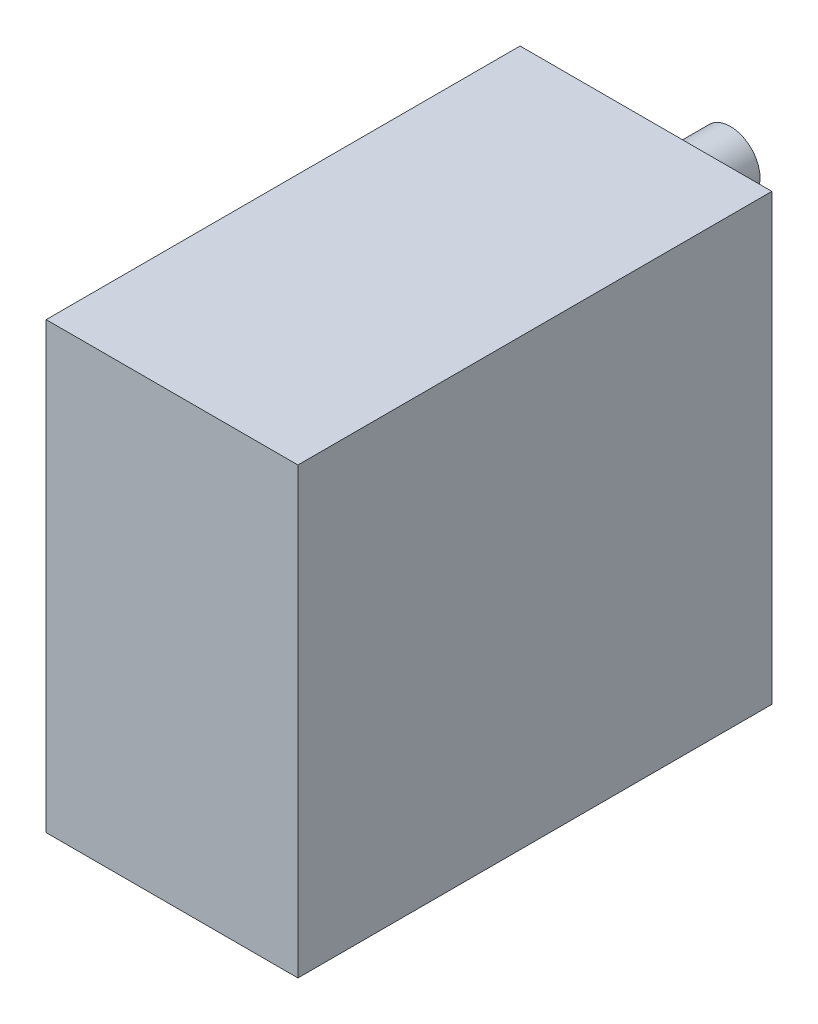
ISO-10303-21;
HEADER;
FILE_DESCRIPTION(('STEP AP214'),'2;1');
FILE_NAME('part.step','',(''),(''),'','','');
FILE_SCHEMA(('AUTOMOTIVE_DESIGN { 1 0 10303 214 1 1 1 1 }'));
ENDSEC;
DATA;
#1=APPLICATION_CONTEXT('core data for automotive mechanical design processes');
#2=APPLICATION_PROTOCOL_DEFINITION('international standard','automotive_design',2000,#1);
#3=PRODUCT_CONTEXT('',#1,'mechanical');
#4=PRODUCT('Part','Part','',(#3));
#5=PRODUCT_RELATED_PRODUCT_CATEGORY('part','',(#4));
#6=PRODUCT_DEFINITION_FORMATION('','',#4);
#7=PRODUCT_DEFINITION_CONTEXT('part definition',#1,'design');
#8=PRODUCT_DEFINITION('design','',#6,#7);
#9=PRODUCT_DEFINITION_SHAPE('','',#8);
#10=(LENGTH_UNIT() NAMED_UNIT(*) SI_UNIT(.MILLI.,.METRE.));
#11=(NAMED_UNIT(*) PLANE_ANGLE_UNIT() SI_UNIT($,.RADIAN.));
#12=(NAMED_UNIT(*) SI_UNIT($,.STERADIAN.) SOLID_ANGLE_UNIT());
#13=UNCERTAINTY_MEASURE_WITH_UNIT(LENGTH_MEASURE(1.E-05),#10,'distance_accuracy_value','');
#14=(GEOMETRIC_REPRESENTATION_CONTEXT(3) GLOBAL_UNCERTAINTY_ASSIGNED_CONTEXT((#13)) GLOBAL_UNIT_ASSIGNED_CONTEXT((#10,
#11,#12)) REPRESENTATION_CONTEXT('',''));
#15=CARTESIAN_POINT('',(0.,0.,0.));
#16=DIRECTION('',(0.,0.,1.));
#17=DIRECTION('',(1.,0.,0.));
#18=AXIS2_PLACEMENT_3D('',#15,#16,#17);
#19=CARTESIAN_POINT('',(25.3847307884647,300.,125.179263210535));
#20=DIRECTION('',(-1.,0.,0.));
#21=DIRECTION('',(0.,0.,1.));
#22=AXIS2_PLACEMENT_3D('',#19,#20,#21);
#23=PLANE('',#22);
#24=DIRECTION('',(0.,0.,-1.));
#25=VECTOR('',#24,1.);
#26=CARTESIAN_POINT('',(25.3847307884647,0.,125.179263210535));
#27=LINE('',#26,#25);
#28=CARTESIAN_POINT('',(25.3847307884647,0.,125.179263210535));
#29=VERTEX_POINT('',#28);
#30=CARTESIAN_POINT('',(25.3847307884647,0.,-194.820736789465));
#31=VERTEX_POINT('',#30);
#32=EDGE_CURVE('E128',#29,#31,#27,.T.);
#33=ORIENTED_EDGE('',*,*,#32,.T.);
#34=DIRECTION('',(0.,-1.,0.));
#35=VECTOR('',#34,1.);
#36=CARTESIAN_POINT('',(25.3847307884647,300.,-194.820736789465));
#37=LINE('',#36,#35);
#38=CARTESIAN_POINT('',(25.3847307884647,300.,-194.820736789465));
#39=VERTEX_POINT('',#38);
#40=EDGE_CURVE('E66',#39,#31,#37,.T.);
#41=ORIENTED_EDGE('',*,*,#40,.F.);
#42=DIRECTION('',(0.,0.,-1.));
#43=VECTOR('',#42,1.);
#44=CARTESIAN_POINT('',(25.3847307884647,300.,125.179263210535));
#45=LINE('',#44,#43);
#46=CARTESIAN_POINT('',(25.3847307884647,300.,125.179263210535));
#47=VERTEX_POINT('',#46);
#48=EDGE_CURVE('E110',#47,#39,#45,.T.);
#49=ORIENTED_EDGE('',*,*,#48,.F.);
#50=DIRECTION('',(0.,-1.,0.));
#51=VECTOR('',#50,1.);
#52=CARTESIAN_POINT('',(25.3847307884647,300.,125.179263210535));
#53=LINE('',#52,#51);
#54=EDGE_CURVE('E124',#47,#29,#53,.T.);
#55=ORIENTED_EDGE('',*,*,#54,.T.);
#56=EDGE_LOOP('',(#33,#41,#49,#55));
#57=FACE_BOUND('',#56,.T.);
#58=ADVANCED_FACE('F57',(#57),#23,.F.);
#59=CARTESIAN_POINT('',(-144.615269211535,300.,-194.820736789465));
#60=DIRECTION('',(0.,0.,1.));
#61=DIRECTION('',(1.,0.,0.));
#62=AXIS2_PLACEMENT_3D('',#59,#60,#61);
#63=PLANE('',#62);
#64=CARTESIAN_POINT('',(-59.6152692115353,247.,-194.820736789465));
#65=DIRECTION('',(0.,0.,1.));
#66=DIRECTION('',(1.,0.,0.));
#67=AXIS2_PLACEMENT_3D('',#64,#65,#66);
#68=CIRCLE('',#67,20.);
#69=CARTESIAN_POINT('',(-39.6152692115352,247.,-194.820736789465));
#70=VERTEX_POINT('',#69);
#71=EDGE_CURVE('E12',#70,#70,#68,.F.);
#72=ORIENTED_EDGE('',*,*,#71,.F.);
#73=EDGE_LOOP('',(#72));
#74=FACE_BOUND('',#73,.T.);
#75=DIRECTION('',(-1.,0.,0.));
#76=VECTOR('',#75,1.);
#77=CARTESIAN_POINT('',(-144.615269211535,0.,-194.820736789465));
#78=LINE('',#77,#76);
#79=CARTESIAN_POINT('',(-144.615269211535,0.,-194.820736789465));
#80=VERTEX_POINT('',#79);
#81=EDGE_CURVE('E116',#31,#80,#78,.T.);
#82=ORIENTED_EDGE('',*,*,#81,.T.);
#83=DIRECTION('',(0.,-1.,0.));
#84=VECTOR('',#83,1.);
#85=CARTESIAN_POINT('',(-144.615269211535,300.,-194.820736789465));
#86=LINE('',#85,#84);
#87=CARTESIAN_POINT('',(-144.615269211535,300.,-194.820736789465));
#88=VERTEX_POINT('',#87);
#89=EDGE_CURVE('E114',#88,#80,#86,.T.);
#90=ORIENTED_EDGE('',*,*,#89,.F.);
#91=DIRECTION('',(-1.,0.,0.));
#92=VECTOR('',#91,1.);
#93=CARTESIAN_POINT('',(-144.615269211535,300.,-194.820736789465));
#94=LINE('',#93,#92);
#95=EDGE_CURVE('E105',#39,#88,#94,.T.);
#96=ORIENTED_EDGE('',*,*,#95,.F.);
#97=ORIENTED_EDGE('',*,*,#40,.T.);
#98=EDGE_LOOP('',(#82,#90,#96,#97));
#99=FACE_BOUND('',#98,.T.);
#100=ADVANCED_FACE('F115',(#74,#99),#63,.F.);
#101=CARTESIAN_POINT('',(-144.615269211535,300.,125.179263210535));
#102=DIRECTION('',(1.,0.,0.));
#103=DIRECTION('',(0.,0.,-1.));
#104=AXIS2_PLACEMENT_3D('',#101,#102,#103);
#105=PLANE('',#104);
#106=DIRECTION('',(0.,0.,1.));
#107=VECTOR('',#106,1.);
#108=CARTESIAN_POINT('',(-144.615269211535,0.,125.179263210535));
#109=LINE('',#108,#107);
#110=CARTESIAN_POINT('',(-144.615269211535,0.,125.179263210535));
#111=VERTEX_POINT('',#110);
#112=EDGE_CURVE('E91',#80,#111,#109,.T.);
#113=ORIENTED_EDGE('',*,*,#112,.T.);
#114=DIRECTION('',(0.,-1.,0.));
#115=VECTOR('',#114,1.);
#116=CARTESIAN_POINT('',(-144.615269211535,300.,125.179263210535));
#117=LINE('',#116,#115);
#118=CARTESIAN_POINT('',(-144.615269211535,300.,125.179263210535));
#119=VERTEX_POINT('',#118);
#120=EDGE_CURVE('E118',#119,#111,#117,.T.);
#121=ORIENTED_EDGE('',*,*,#120,.F.);
#122=DIRECTION('',(0.,0.,1.));
#123=VECTOR('',#122,1.);
#124=CARTESIAN_POINT('',(-144.615269211535,300.,125.179263210535));
#125=LINE('',#124,#123);
#126=EDGE_CURVE('E108',#88,#119,#125,.T.);
#127=ORIENTED_EDGE('',*,*,#126,.F.);
#128=ORIENTED_EDGE('',*,*,#89,.T.);
#129=EDGE_LOOP('',(#113,#121,#127,#128));
#130=FACE_BOUND('',#129,.T.);
#131=ADVANCED_FACE('F120',(#130),#105,.F.);
#132=CARTESIAN_POINT('',(-144.615269211535,300.,125.179263210535));
#133=DIRECTION('',(0.,0.,-1.));
#134=DIRECTION('',(-1.,0.,0.));
#135=AXIS2_PLACEMENT_3D('',#132,#133,#134);
#136=PLANE('',#135);
#137=DIRECTION('',(1.,0.,0.));
#138=VECTOR('',#137,1.);
#139=CARTESIAN_POINT('',(-144.615269211535,0.,125.179263210535));
#140=LINE('',#139,#138);
#141=EDGE_CURVE('E97',#111,#29,#140,.T.);
#142=ORIENTED_EDGE('',*,*,#141,.T.);
#143=ORIENTED_EDGE('',*,*,#54,.F.);
#144=DIRECTION('',(1.,0.,0.));
#145=VECTOR('',#144,1.);
#146=CARTESIAN_POINT('',(-144.615269211535,300.,125.179263210535));
#147=LINE('',#146,#145);
#148=EDGE_CURVE('E74',#119,#47,#147,.T.);
#149=ORIENTED_EDGE('',*,*,#148,.F.);
#150=ORIENTED_EDGE('',*,*,#120,.T.);
#151=EDGE_LOOP('',(#142,#143,#149,#150));
#152=FACE_BOUND('',#151,.T.);
#153=ADVANCED_FACE('F158',(#152),#136,.F.);
#154=CARTESIAN_POINT('',(0.,300.,0.));
#155=DIRECTION('',(0.,-1.,0.));
#156=DIRECTION('',(0.,0.,-1.));
#157=AXIS2_PLACEMENT_3D('',#154,#155,#156);
#158=PLANE('',#157);
#159=ORIENTED_EDGE('',*,*,#48,.T.);
#160=ORIENTED_EDGE('',*,*,#95,.T.);
#161=ORIENTED_EDGE('',*,*,#126,.T.);
#162=ORIENTED_EDGE('',*,*,#148,.T.);
#163=EDGE_LOOP('',(#159,#160,#161,#162));
#164=FACE_BOUND('',#163,.T.);
#165=ADVANCED_FACE('F106',(#164),#158,.F.);
#166=CARTESIAN_POINT('',(0.,0.,0.));
#167=DIRECTION('',(0.,-1.,0.));
#168=DIRECTION('',(0.,0.,-1.));
#169=AXIS2_PLACEMENT_3D('',#166,#167,#168);
#170=PLANE('',#169);
#171=ORIENTED_EDGE('',*,*,#32,.F.);
#172=ORIENTED_EDGE('',*,*,#141,.F.);
#173=ORIENTED_EDGE('',*,*,#112,.F.);
#174=ORIENTED_EDGE('',*,*,#81,.F.);
#175=EDGE_LOOP('',(#171,#172,#173,#174));
#176=FACE_BOUND('',#175,.T.);
#177=ADVANCED_FACE('F146',(#176),#170,.T.);
#178=CARTESIAN_POINT('',(-59.6152692115353,247.,-251.820736789465));
#179=DIRECTION('',(0.,0.,-1.));
#180=DIRECTION('',(-1.,0.,0.));
#181=AXIS2_PLACEMENT_3D('',#178,#179,#180);
#182=PLANE('',#181);
#183=CARTESIAN_POINT('',(-59.6152692115353,247.,-251.820736789465));
#184=DIRECTION('',(0.,0.,-1.));
#185=DIRECTION('',(-1.,0.,0.));
#186=AXIS2_PLACEMENT_3D('',#183,#184,#185);
#187=CIRCLE('',#186,20.);
#188=CARTESIAN_POINT('',(-39.6152692115352,247.,-251.820736789465));
#189=VERTEX_POINT('',#188);
#190=EDGE_CURVE('E132',#189,#189,#187,.T.);
#191=ORIENTED_EDGE('',*,*,#190,.T.);
#192=EDGE_LOOP('',(#191));
#193=FACE_BOUND('',#192,.T.);
#194=CARTESIAN_POINT('',(-59.6152692115353,247.,-251.820736789465));
#195=DIRECTION('',(0.,0.,-1.));
#196=DIRECTION('',(-1.,0.,0.));
#197=AXIS2_PLACEMENT_3D('',#194,#195,#196);
#198=CIRCLE('',#197,15.);
#199=CARTESIAN_POINT('',(-44.6152692115353,247.,-251.820736789465));
#200=VERTEX_POINT('',#199);
#201=EDGE_CURVE('E184',#200,#200,#198,.T.);
#202=ORIENTED_EDGE('',*,*,#201,.F.);
#203=EDGE_LOOP('',(#202));
#204=FACE_BOUND('',#203,.T.);
#205=ADVANCED_FACE('F148',(#193,#204),#182,.T.);
#206=CARTESIAN_POINT('',(-59.6152692115353,247.,-251.820736789465));
#207=DIRECTION('',(0.,0.,1.));
#208=DIRECTION('',(1.,0.,0.));
#209=AXIS2_PLACEMENT_3D('',#206,#207,#208);
#210=CYLINDRICAL_SURFACE('',#209,20.);
#211=CARTESIAN_POINT('',(-39.6152692115352,247.,-251.820736789465));
#212=CARTESIAN_POINT('',(-39.6152692115352,247.,-251.226986789465));
#213=CARTESIAN_POINT('',(-39.6152692115352,247.,-250.633236789465));
#214=CARTESIAN_POINT('',(-39.6152692115352,247.,-249.445736789465));
#215=CARTESIAN_POINT('',(-39.6152692115352,247.,-248.851986789465));
#216=CARTESIAN_POINT('',(-39.6152692115352,247.,-247.664486789465));
#217=CARTESIAN_POINT('',(-39.6152692115352,247.,-247.070736789465));
#218=CARTESIAN_POINT('',(-39.6152692115352,247.,-245.883236789465));
#219=CARTESIAN_POINT('',(-39.6152692115352,247.,-245.289486789465));
#220=CARTESIAN_POINT('',(-39.6152692115352,247.,-244.101986789465));
#221=CARTESIAN_POINT('',(-39.6152692115352,247.,-243.508236789465));
#222=CARTESIAN_POINT('',(-39.6152692115352,247.,-242.320736789465));
#223=CARTESIAN_POINT('',(-39.6152692115352,247.,-241.726986789465));
#224=CARTESIAN_POINT('',(-39.6152692115352,247.,-240.539486789465));
#225=CARTESIAN_POINT('',(-39.6152692115352,247.,-239.945736789465));
#226=CARTESIAN_POINT('',(-39.6152692115352,247.,-238.758236789465));
#227=CARTESIAN_POINT('',(-39.6152692115352,247.,-238.164486789465));
#228=CARTESIAN_POINT('',(-39.6152692115352,247.,-236.976986789465));
#229=CARTESIAN_POINT('',(-39.6152692115352,247.,-236.383236789465));
#230=CARTESIAN_POINT('',(-39.6152692115352,247.,-235.195736789465));
#231=CARTESIAN_POINT('',(-39.6152692115352,247.,-234.601986789465));
#232=CARTESIAN_POINT('',(-39.6152692115352,247.,-233.414486789465));
#233=CARTESIAN_POINT('',(-39.6152692115352,247.,-232.820736789465));
#234=CARTESIAN_POINT('',(-39.6152692115352,247.,-231.633236789465));
#235=CARTESIAN_POINT('',(-39.6152692115352,247.,-231.039486789465));
#236=CARTESIAN_POINT('',(-39.6152692115352,247.,-229.851986789465));
#237=CARTESIAN_POINT('',(-39.6152692115352,247.,-229.258236789465));
#238=CARTESIAN_POINT('',(-39.6152692115352,247.,-228.070736789465));
#239=CARTESIAN_POINT('',(-39.6152692115352,247.,-227.476986789465));
#240=CARTESIAN_POINT('',(-39.6152692115352,247.,-226.289486789465));
#241=CARTESIAN_POINT('',(-39.6152692115352,247.,-225.695736789465));
#242=CARTESIAN_POINT('',(-39.6152692115352,247.,-224.508236789465));
#243=CARTESIAN_POINT('',(-39.6152692115352,247.,-223.914486789465));
#244=CARTESIAN_POINT('',(-39.6152692115352,247.,-222.726986789465));
#245=CARTESIAN_POINT('',(-39.6152692115352,247.,-222.133236789465));
#246=CARTESIAN_POINT('',(-39.6152692115352,247.,-220.945736789465));
#247=CARTESIAN_POINT('',(-39.6152692115352,247.,-220.351986789465));
#248=CARTESIAN_POINT('',(-39.6152692115352,247.,-219.164486789465));
#249=CARTESIAN_POINT('',(-39.6152692115352,247.,-218.570736789465));
#250=CARTESIAN_POINT('',(-39.6152692115352,247.,-217.383236789465));
#251=CARTESIAN_POINT('',(-39.6152692115352,247.,-216.789486789465));
#252=CARTESIAN_POINT('',(-39.6152692115352,247.,-215.601986789465));
#253=CARTESIAN_POINT('',(-39.6152692115352,247.,-215.008236789465));
#254=CARTESIAN_POINT('',(-39.6152692115352,247.,-213.820736789465));
#255=CARTESIAN_POINT('',(-39.6152692115352,247.,-213.226986789465));
#256=CARTESIAN_POINT('',(-39.6152692115352,247.,-212.039486789465));
#257=CARTESIAN_POINT('',(-39.6152692115352,247.,-211.445736789465));
#258=CARTESIAN_POINT('',(-39.6152692115352,247.,-210.258236789465));
#259=CARTESIAN_POINT('',(-39.6152692115352,247.,-209.664486789465));
#260=CARTESIAN_POINT('',(-39.6152692115352,247.,-208.476986789465));
#261=CARTESIAN_POINT('',(-39.6152692115352,247.,-207.883236789465));
#262=CARTESIAN_POINT('',(-39.6152692115352,247.,-206.695736789465));
#263=CARTESIAN_POINT('',(-39.6152692115352,247.,-206.101986789465));
#264=CARTESIAN_POINT('',(-39.6152692115352,247.,-204.914486789465));
#265=CARTESIAN_POINT('',(-39.6152692115352,247.,-204.320736789465));
#266=CARTESIAN_POINT('',(-39.6152692115352,247.,-203.133236789465));
#267=CARTESIAN_POINT('',(-39.6152692115352,247.,-202.539486789465));
#268=CARTESIAN_POINT('',(-39.6152692115352,247.,-201.351986789465));
#269=CARTESIAN_POINT('',(-39.6152692115352,247.,-200.758236789465));
#270=CARTESIAN_POINT('',(-39.6152692115352,247.,-199.570736789465));
#271=CARTESIAN_POINT('',(-39.6152692115352,247.,-198.976986789465));
#272=CARTESIAN_POINT('',(-39.6152692115352,247.,-197.789486789465));
#273=CARTESIAN_POINT('',(-39.6152692115352,247.,-197.195736789465));
#274=CARTESIAN_POINT('',(-39.6152692115352,247.,-196.008236789465));
#275=CARTESIAN_POINT('',(-39.6152692115352,247.,-195.414486789465));
#276=CARTESIAN_POINT('',(-39.6152692115352,247.,-194.820736789465));
#277=B_SPLINE_CURVE_WITH_KNOTS('',3,(#211,#212,#213,#214,#215,#216,#217,#218,#219,#220,#221,
#222,#223,#224,#225,#226,#227,#228,#229,#230,#231,#232,#233,#234,#235,#236,#237,#238,#239,#240,
#241,#242,#243,#244,#245,#246,#247,#248,#249,#250,#251,#252,#253,#254,#255,#256,#257,#258,#259,
#260,#261,#262,#263,#264,#265,#266,#267,#268,#269,#270,#271,#272,#273,#274,#275,#276),
.UNSPECIFIED.,.F.,.F.,(4,2,2,2,2,2,2,2,2,2,2,2,2,2,2,2,2,2,2,2,2,2,2,2,2,2,2,2,2,2,2,2,4),(0.,
1.78124999999996,3.56249999999997,5.34374999999995,7.12499999999994,8.90624999999995,
10.6874999999999,12.4687499999999,14.2499999999999,16.0312499999999,17.8124999999999,
19.5937499999999,21.3749999999999,23.1562499999999,24.9374999999999,26.7187499999999,
28.4999999999999,30.2812499999999,32.0624999999999,33.8437499999998,35.6249999999998,
37.4062499999998,39.1874999999998,40.9687499999998,42.7499999999998,44.5312499999998,
46.3124999999998,48.0937499999998,49.8749999999998,51.6562499999998,53.4374999999998,
55.2187499999998,56.9999999999997),.UNSPECIFIED.);
#278=EDGE_CURVE('BSEAM155',#189,#70,#277,.T.);
#279=ORIENTED_EDGE('',*,*,#190,.F.);
#280=ORIENTED_EDGE('',*,*,#71,.T.);
#281=ORIENTED_EDGE('',*,*,#278,.T.);
#282=ORIENTED_EDGE('',*,*,#278,.F.);
#283=EDGE_LOOP('',(#279,#281,#280,#282));
#284=FACE_BOUND('',#283,.T.);
#285=ADVANCED_FACE('F155',(#284),#210,.T.);
#286=CARTESIAN_POINT('',(-59.6152692115353,247.,-251.820736789465));
#287=DIRECTION('',(0.,0.,1.));
#288=DIRECTION('',(1.,0.,0.));
#289=AXIS2_PLACEMENT_3D('',#286,#287,#288);
#290=CYLINDRICAL_SURFACE('',#289,15.);
#291=CARTESIAN_POINT('',(-59.6152692115353,247.,-194.820736789465));
#292=DIRECTION('',(0.,0.,-1.));
#293=DIRECTION('',(-1.,0.,0.));
#294=AXIS2_PLACEMENT_3D('',#291,#292,#293);
#295=CIRCLE('',#294,15.);
#296=CARTESIAN_POINT('',(-44.6152692115353,247.,-194.820736789465));
#297=VERTEX_POINT('',#296);
#298=EDGE_CURVE('E181',#297,#297,#295,.T.);
#299=CARTESIAN_POINT('',(-44.6152692115353,247.,-251.820736789465));
#300=CARTESIAN_POINT('',(-44.6152692115353,247.,-251.226986789465));
#301=CARTESIAN_POINT('',(-44.6152692115353,247.,-250.633236789465));
#302=CARTESIAN_POINT('',(-44.6152692115353,247.,-249.445736789465));
#303=CARTESIAN_POINT('',(-44.6152692115353,247.,-248.851986789465));
#304=CARTESIAN_POINT('',(-44.6152692115353,247.,-247.664486789465));
#305=CARTESIAN_POINT('',(-44.6152692115353,247.,-247.070736789465));
#306=CARTESIAN_POINT('',(-44.6152692115353,247.,-245.883236789465));
#307=CARTESIAN_POINT('',(-44.6152692115353,247.,-245.289486789465));
#308=CARTESIAN_POINT('',(-44.6152692115353,247.,-244.101986789465));
#309=CARTESIAN_POINT('',(-44.6152692115353,247.,-243.508236789465));
#310=CARTESIAN_POINT('',(-44.6152692115353,247.,-242.320736789465));
#311=CARTESIAN_POINT('',(-44.6152692115353,247.,-241.726986789465));
#312=CARTESIAN_POINT('',(-44.6152692115353,247.,-240.539486789465));
#313=CARTESIAN_POINT('',(-44.6152692115353,247.,-239.945736789465));
#314=CARTESIAN_POINT('',(-44.6152692115353,247.,-238.758236789465));
#315=CARTESIAN_POINT('',(-44.6152692115353,247.,-238.164486789465));
#316=CARTESIAN_POINT('',(-44.6152692115353,247.,-236.976986789465));
#317=CARTESIAN_POINT('',(-44.6152692115353,247.,-236.383236789465));
#318=CARTESIAN_POINT('',(-44.6152692115353,247.,-235.195736789465));
#319=CARTESIAN_POINT('',(-44.6152692115353,247.,-234.601986789465));
#320=CARTESIAN_POINT('',(-44.6152692115353,247.,-233.414486789465));
#321=CARTESIAN_POINT('',(-44.6152692115353,247.,-232.820736789465));
#322=CARTESIAN_POINT('',(-44.6152692115353,247.,-231.633236789465));
#323=CARTESIAN_POINT('',(-44.6152692115353,247.,-231.039486789465));
#324=CARTESIAN_POINT('',(-44.6152692115353,247.,-229.851986789465));
#325=CARTESIAN_POINT('',(-44.6152692115353,247.,-229.258236789465));
#326=CARTESIAN_POINT('',(-44.6152692115353,247.,-228.070736789465));
#327=CARTESIAN_POINT('',(-44.6152692115353,247.,-227.476986789465));
#328=CARTESIAN_POINT('',(-44.6152692115353,247.,-226.289486789465));
#329=CARTESIAN_POINT('',(-44.6152692115353,247.,-225.695736789465));
#330=CARTESIAN_POINT('',(-44.6152692115353,247.,-224.508236789465));
#331=CARTESIAN_POINT('',(-44.6152692115353,247.,-223.914486789465));
#332=CARTESIAN_POINT('',(-44.6152692115353,247.,-222.726986789465));
#333=CARTESIAN_POINT('',(-44.6152692115353,247.,-222.133236789465));
#334=CARTESIAN_POINT('',(-44.6152692115353,247.,-220.945736789465));
#335=CARTESIAN_POINT('',(-44.6152692115353,247.,-220.351986789465));
#336=CARTESIAN_POINT('',(-44.6152692115353,247.,-219.164486789465));
#337=CARTESIAN_POINT('',(-44.6152692115353,247.,-218.570736789465));
#338=CARTESIAN_POINT('',(-44.6152692115353,247.,-217.383236789465));
#339=CARTESIAN_POINT('',(-44.6152692115353,247.,-216.789486789465));
#340=CARTESIAN_POINT('',(-44.6152692115353,247.,-215.601986789465));
#341=CARTESIAN_POINT('',(-44.6152692115353,247.,-215.008236789465));
#342=CARTESIAN_POINT('',(-44.6152692115353,247.,-213.820736789465));
#343=CARTESIAN_POINT('',(-44.6152692115353,247.,-213.226986789465));
#344=CARTESIAN_POINT('',(-44.6152692115353,247.,-212.039486789465));
#345=CARTESIAN_POINT('',(-44.6152692115353,247.,-211.445736789465));
#346=CARTESIAN_POINT('',(-44.6152692115353,247.,-210.258236789465));
#347=CARTESIAN_POINT('',(-44.6152692115353,247.,-209.664486789465));
#348=CARTESIAN_POINT('',(-44.6152692115353,247.,-208.476986789465));
#349=CARTESIAN_POINT('',(-44.6152692115353,247.,-207.883236789465));
#350=CARTESIAN_POINT('',(-44.6152692115353,247.,-206.695736789465));
#351=CARTESIAN_POINT('',(-44.6152692115353,247.,-206.101986789465));
#352=CARTESIAN_POINT('',(-44.6152692115353,247.,-204.914486789465));
#353=CARTESIAN_POINT('',(-44.6152692115353,247.,-204.320736789465));
#354=CARTESIAN_POINT('',(-44.6152692115353,247.,-203.133236789465));
#355=CARTESIAN_POINT('',(-44.6152692115353,247.,-202.539486789465));
#356=CARTESIAN_POINT('',(-44.6152692115353,247.,-201.351986789465));
#357=CARTESIAN_POINT('',(-44.6152692115353,247.,-200.758236789465));
#358=CARTESIAN_POINT('',(-44.6152692115353,247.,-199.570736789465));
#359=CARTESIAN_POINT('',(-44.6152692115353,247.,-198.976986789465));
#360=CARTESIAN_POINT('',(-44.6152692115353,247.,-197.789486789465));
#361=CARTESIAN_POINT('',(-44.6152692115353,247.,-197.195736789465));
#362=CARTESIAN_POINT('',(-44.6152692115353,247.,-196.008236789465));
#363=CARTESIAN_POINT('',(-44.6152692115353,247.,-195.414486789465));
#364=CARTESIAN_POINT('',(-44.6152692115353,247.,-194.820736789465));
#365=B_SPLINE_CURVE_WITH_KNOTS('',3,(#299,#300,#301,#302,#303,#304,#305,#306,#307,#308,#309,
#310,#311,#312,#313,#314,#315,#316,#317,#318,#319,#320,#321,#322,#323,#324,#325,#326,#327,#328,
#329,#330,#331,#332,#333,#334,#335,#336,#337,#338,#339,#340,#341,#342,#343,#344,#345,#346,#347,
#348,#349,#350,#351,#352,#353,#354,#355,#356,#357,#358,#359,#360,#361,#362,#363,#364),
.UNSPECIFIED.,.F.,.F.,(4,2,2,2,2,2,2,2,2,2,2,2,2,2,2,2,2,2,2,2,2,2,2,2,2,2,2,2,2,2,2,2,4),(0.,
1.78124999999996,3.56249999999997,5.34374999999995,7.12499999999994,8.90624999999995,
10.6874999999999,12.4687499999999,14.2499999999999,16.0312499999999,17.8124999999999,
19.5937499999999,21.3749999999999,23.1562499999999,24.9374999999999,26.7187499999999,
28.4999999999999,30.2812499999999,32.0624999999999,33.8437499999999,35.6249999999999,
37.4062499999999,39.1874999999999,40.9687499999998,42.7499999999998,44.5312499999998,
46.3124999999998,48.0937499999998,49.8749999999998,51.6562499999998,53.4374999999998,
55.2187499999998,56.9999999999998),.UNSPECIFIED.);
#366=EDGE_CURVE('BSEAM172',#200,#297,#365,.T.);
#367=ORIENTED_EDGE('',*,*,#201,.T.);
#368=ORIENTED_EDGE('',*,*,#298,.F.);
#369=ORIENTED_EDGE('',*,*,#366,.T.);
#370=ORIENTED_EDGE('',*,*,#366,.F.);
#371=EDGE_LOOP('',(#367,#369,#368,#370));
#372=FACE_BOUND('',#371,.T.);
#373=ADVANCED_FACE('F172',(#372),#290,.F.);
#374=ORIENTED_EDGE('',*,*,#298,.T.);
#375=EDGE_LOOP('',(#374));
#376=FACE_BOUND('',#375,.T.);
#377=ADVANCED_FACE('F166',(#376),#63,.F.);
#378=CLOSED_SHELL('',(#58,#100,#131,#153,#165,#177,#205,#285,#373,#377));
#379=MANIFOLD_SOLID_BREP('B2',#378);
#380=ADVANCED_BREP_SHAPE_REPRESENTATION('',(#18,#379),#14);
#381=SHAPE_DEFINITION_REPRESENTATION(#9,#380);
ENDSEC;
END-ISO-10303-21;
